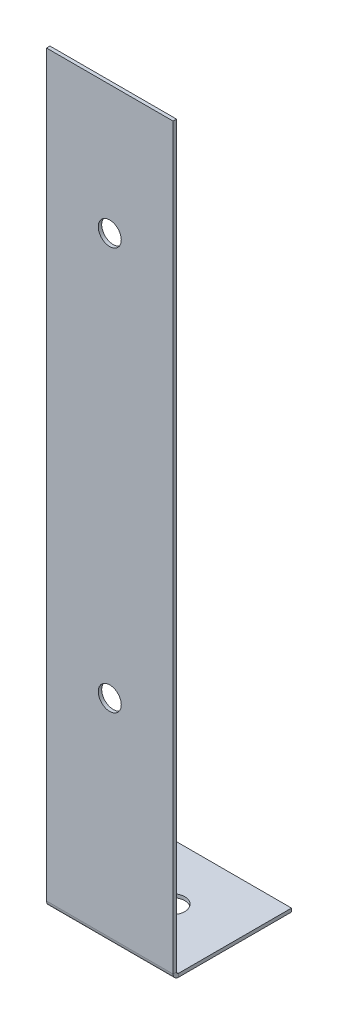
ISO-10303-21;
HEADER;
FILE_DESCRIPTION(('STEP AP214'),'2;1');
FILE_NAME('part.step','',(''),(''),'','','');
FILE_SCHEMA(('AUTOMOTIVE_DESIGN { 1 0 10303 214 1 1 1 1 }'));
ENDSEC;
DATA;
#1=APPLICATION_CONTEXT('core data for automotive mechanical design processes');
#2=APPLICATION_PROTOCOL_DEFINITION('international standard','automotive_design',2000,#1);
#3=PRODUCT_CONTEXT('',#1,'mechanical');
#4=PRODUCT('Part','Part','',(#3));
#5=PRODUCT_RELATED_PRODUCT_CATEGORY('part','',(#4));
#6=PRODUCT_DEFINITION_FORMATION('','',#4);
#7=PRODUCT_DEFINITION_CONTEXT('part definition',#1,'design');
#8=PRODUCT_DEFINITION('design','',#6,#7);
#9=PRODUCT_DEFINITION_SHAPE('','',#8);
#10=(LENGTH_UNIT() NAMED_UNIT(*) SI_UNIT(.MILLI.,.METRE.));
#11=(NAMED_UNIT(*) PLANE_ANGLE_UNIT() SI_UNIT($,.RADIAN.));
#12=(NAMED_UNIT(*) SI_UNIT($,.STERADIAN.) SOLID_ANGLE_UNIT());
#13=UNCERTAINTY_MEASURE_WITH_UNIT(LENGTH_MEASURE(1.E-05),#10,'distance_accuracy_value','');
#14=(GEOMETRIC_REPRESENTATION_CONTEXT(3) GLOBAL_UNCERTAINTY_ASSIGNED_CONTEXT((#13)) GLOBAL_UNIT_ASSIGNED_CONTEXT((#10,
#11,#12)) REPRESENTATION_CONTEXT('',''));
#15=CARTESIAN_POINT('',(0.,0.,0.));
#16=DIRECTION('',(0.,0.,1.));
#17=DIRECTION('',(1.,0.,0.));
#18=AXIS2_PLACEMENT_3D('',#15,#16,#17);
#19=CARTESIAN_POINT('',(-22.,-42.4,-108.8));
#20=DIRECTION('',(-1.,0.,0.));
#21=DIRECTION('',(0.,1.,0.));
#22=AXIS2_PLACEMENT_3D('',#19,#20,#21);
#23=PLANE('',#22);
#24=DIRECTION('',(0.,1.,0.));
#25=VECTOR('',#24,1.);
#26=CARTESIAN_POINT('',(-22.,-42.4,-110.));
#27=LINE('',#26,#25);
#28=CARTESIAN_POINT('',(-22.,0.736600000000001,-110.));
#29=VERTEX_POINT('',#28);
#30=CARTESIAN_POINT('',(-22.,257.6,-110.000000000001));
#31=VERTEX_POINT('',#30);
#32=EDGE_CURVE('E106',#29,#31,#27,.T.);
#33=ORIENTED_EDGE('',*,*,#32,.F.);
#34=DIRECTION('',(0.,0.,1.));
#35=VECTOR('',#34,1.);
#36=CARTESIAN_POINT('',(-22.,0.736600000000004,-108.8));
#37=LINE('',#36,#35);
#38=CARTESIAN_POINT('',(-22.,0.736600000000002,-108.8));
#39=VERTEX_POINT('',#38);
#40=EDGE_CURVE('E118',#29,#39,#37,.T.);
#41=ORIENTED_EDGE('',*,*,#40,.T.);
#42=DIRECTION('',(0.,1.,0.));
#43=VECTOR('',#42,1.);
#44=CARTESIAN_POINT('',(-22.,-42.4,-108.8));
#45=LINE('',#44,#43);
#46=CARTESIAN_POINT('',(-22.,257.6,-108.800000000001));
#47=VERTEX_POINT('',#46);
#48=EDGE_CURVE('E102',#39,#47,#45,.T.);
#49=ORIENTED_EDGE('',*,*,#48,.T.);
#50=DIRECTION('',(0.,0.,-1.));
#51=VECTOR('',#50,1.);
#52=CARTESIAN_POINT('',(-22.,257.6,-108.800000000001));
#53=LINE('',#52,#51);
#54=EDGE_CURVE('E95',#47,#31,#53,.T.);
#55=ORIENTED_EDGE('',*,*,#54,.T.);
#56=EDGE_LOOP('',(#33,#41,#49,#55));
#57=FACE_BOUND('',#56,.T.);
#58=ADVANCED_FACE('F49',(#57),#23,.T.);
#59=CARTESIAN_POINT('',(22.,-42.4,-108.8));
#60=DIRECTION('',(1.,0.,0.));
#61=DIRECTION('',(0.,-1.,0.));
#62=AXIS2_PLACEMENT_3D('',#59,#60,#61);
#63=PLANE('',#62);
#64=DIRECTION('',(0.,-1.,0.));
#65=VECTOR('',#64,1.);
#66=CARTESIAN_POINT('',(22.,-42.4,-108.8));
#67=LINE('',#66,#65);
#68=CARTESIAN_POINT('',(22.,257.6,-108.800000000001));
#69=VERTEX_POINT('',#68);
#70=CARTESIAN_POINT('',(22.,0.736600000000004,-108.8));
#71=VERTEX_POINT('',#70);
#72=EDGE_CURVE('E115',#69,#71,#67,.T.);
#73=ORIENTED_EDGE('',*,*,#72,.T.);
#74=DIRECTION('',(0.,0.,-1.));
#75=VECTOR('',#74,1.);
#76=CARTESIAN_POINT('',(22.,0.736600000000004,-108.8));
#77=LINE('',#76,#75);
#78=CARTESIAN_POINT('',(22.,0.736600000000001,-110.));
#79=VERTEX_POINT('',#78);
#80=EDGE_CURVE('E12',#71,#79,#77,.T.);
#81=ORIENTED_EDGE('',*,*,#80,.T.);
#82=DIRECTION('',(0.,-1.,0.));
#83=VECTOR('',#82,1.);
#84=CARTESIAN_POINT('',(22.,-42.4,-110.));
#85=LINE('',#84,#83);
#86=CARTESIAN_POINT('',(22.,257.6,-110.000000000001));
#87=VERTEX_POINT('',#86);
#88=EDGE_CURVE('E98',#87,#79,#85,.T.);
#89=ORIENTED_EDGE('',*,*,#88,.F.);
#90=DIRECTION('',(0.,0.,-1.));
#91=VECTOR('',#90,1.);
#92=CARTESIAN_POINT('',(22.,257.6,-108.800000000001));
#93=LINE('',#92,#91);
#94=EDGE_CURVE('E75',#69,#87,#93,.T.);
#95=ORIENTED_EDGE('',*,*,#94,.F.);
#96=EDGE_LOOP('',(#73,#81,#89,#95));
#97=FACE_BOUND('',#96,.T.);
#98=ADVANCED_FACE('F51',(#97),#63,.T.);
#99=CARTESIAN_POINT('',(0.,107.6,-108.8));
#100=DIRECTION('',(0.,0.,1.));
#101=DIRECTION('',(0.,-1.,0.));
#102=AXIS2_PLACEMENT_3D('',#99,#100,#101);
#103=PLANE('',#102);
#104=CARTESIAN_POINT('',(0.,72.7999999999999,-108.8));
#105=DIRECTION('',(0.,0.,1.));
#106=DIRECTION('',(1.,0.,0.));
#107=AXIS2_PLACEMENT_3D('',#104,#105,#106);
#108=CIRCLE('',#107,4.);
#109=CARTESIAN_POINT('',(4.,72.7999999999999,-108.8));
#110=VERTEX_POINT('',#109);
#111=EDGE_CURVE('E128',#110,#110,#108,.T.);
#112=ORIENTED_EDGE('',*,*,#111,.F.);
#113=EDGE_LOOP('',(#112));
#114=FACE_BOUND('',#113,.T.);
#115=CARTESIAN_POINT('',(0.,212.8,-108.8));
#116=DIRECTION('',(0.,0.,1.));
#117=DIRECTION('',(1.,0.,0.));
#118=AXIS2_PLACEMENT_3D('',#115,#116,#117);
#119=CIRCLE('',#118,4.);
#120=CARTESIAN_POINT('',(4.,212.8,-108.8));
#121=VERTEX_POINT('',#120);
#122=EDGE_CURVE('E184',#121,#121,#119,.T.);
#123=ORIENTED_EDGE('',*,*,#122,.F.);
#124=EDGE_LOOP('',(#123));
#125=FACE_BOUND('',#124,.T.);
#126=ORIENTED_EDGE('',*,*,#48,.F.);
#127=DIRECTION('',(1.,0.,0.));
#128=VECTOR('',#127,1.);
#129=CARTESIAN_POINT('',(0.,0.736600000000004,-108.8));
#130=LINE('',#129,#128);
#131=EDGE_CURVE('E94',#39,#71,#130,.T.);
#132=ORIENTED_EDGE('',*,*,#131,.T.);
#133=ORIENTED_EDGE('',*,*,#72,.F.);
#134=DIRECTION('',(1.,0.,0.));
#135=VECTOR('',#134,1.);
#136=CARTESIAN_POINT('',(22.,257.6,-108.800000000001));
#137=LINE('',#136,#135);
#138=EDGE_CURVE('E93',#47,#69,#137,.T.);
#139=ORIENTED_EDGE('',*,*,#138,.F.);
#140=EDGE_LOOP('',(#126,#132,#133,#139));
#141=FACE_BOUND('',#140,.T.);
#142=ADVANCED_FACE('F216',(#114,#125,#141),#103,.T.);
#143=CARTESIAN_POINT('',(22.,257.6,-108.800000000001));
#144=DIRECTION('',(0.,1.,0.));
#145=DIRECTION('',(1.,0.,0.));
#146=AXIS2_PLACEMENT_3D('',#143,#144,#145);
#147=PLANE('',#146);
#148=DIRECTION('',(1.,0.,0.));
#149=VECTOR('',#148,1.);
#150=CARTESIAN_POINT('',(22.,257.6,-110.000000000001));
#151=LINE('',#150,#149);
#152=EDGE_CURVE('E91',#31,#87,#151,.T.);
#153=ORIENTED_EDGE('',*,*,#152,.F.);
#154=ORIENTED_EDGE('',*,*,#54,.F.);
#155=ORIENTED_EDGE('',*,*,#138,.T.);
#156=ORIENTED_EDGE('',*,*,#94,.T.);
#157=EDGE_LOOP('',(#153,#154,#155,#156));
#158=FACE_BOUND('',#157,.T.);
#159=ADVANCED_FACE('F88',(#158),#147,.T.);
#160=CARTESIAN_POINT('',(0.,107.6,-110.));
#161=DIRECTION('',(0.,0.,1.));
#162=DIRECTION('',(0.,-1.,0.));
#163=AXIS2_PLACEMENT_3D('',#160,#161,#162);
#164=PLANE('',#163);
#165=CARTESIAN_POINT('',(0.,72.7999999999999,-110.));
#166=DIRECTION('',(0.,0.,1.));
#167=DIRECTION('',(0.,-1.,0.));
#168=AXIS2_PLACEMENT_3D('',#165,#166,#167);
#169=CIRCLE('',#168,4.);
#170=CARTESIAN_POINT('',(0.,68.7999999999999,-110.));
#171=VERTEX_POINT('',#170);
#172=EDGE_CURVE('E127',#171,#171,#169,.T.);
#173=ORIENTED_EDGE('',*,*,#172,.T.);
#174=EDGE_LOOP('',(#173));
#175=FACE_BOUND('',#174,.T.);
#176=CARTESIAN_POINT('',(0.,212.8,-110.000000000001));
#177=DIRECTION('',(0.,0.,1.));
#178=DIRECTION('',(0.,-1.,0.));
#179=AXIS2_PLACEMENT_3D('',#176,#177,#178);
#180=CIRCLE('',#179,4.);
#181=CARTESIAN_POINT('',(0.,208.8,-110.000000000001));
#182=VERTEX_POINT('',#181);
#183=EDGE_CURVE('E125',#182,#182,#180,.T.);
#184=ORIENTED_EDGE('',*,*,#183,.T.);
#185=EDGE_LOOP('',(#184));
#186=FACE_BOUND('',#185,.T.);
#187=DIRECTION('',(1.,0.,0.));
#188=VECTOR('',#187,1.);
#189=CARTESIAN_POINT('',(0.,0.736600000000004,-110.));
#190=LINE('',#189,#188);
#191=EDGE_CURVE('E58',#29,#79,#190,.T.);
#192=ORIENTED_EDGE('',*,*,#191,.F.);
#193=ORIENTED_EDGE('',*,*,#32,.T.);
#194=ORIENTED_EDGE('',*,*,#152,.T.);
#195=ORIENTED_EDGE('',*,*,#88,.T.);
#196=EDGE_LOOP('',(#192,#193,#194,#195));
#197=FACE_BOUND('',#196,.T.);
#198=ADVANCED_FACE('F104',(#175,#186,#197),#164,.F.);
#199=CARTESIAN_POINT('',(22.,-1.2,-150.));
#200=DIRECTION('',(0.,0.,-1.));
#201=DIRECTION('',(-1.,0.,0.));
#202=AXIS2_PLACEMENT_3D('',#199,#200,#201);
#203=PLANE('',#202);
#204=DIRECTION('',(-1.,0.,0.));
#205=VECTOR('',#204,1.);
#206=CARTESIAN_POINT('',(22.,0.,-150.));
#207=LINE('',#206,#205);
#208=CARTESIAN_POINT('',(22.,0.,-150.));
#209=VERTEX_POINT('',#208);
#210=CARTESIAN_POINT('',(-22.,0.,-150.));
#211=VERTEX_POINT('',#210);
#212=EDGE_CURVE('E152',#209,#211,#207,.T.);
#213=ORIENTED_EDGE('',*,*,#212,.F.);
#214=DIRECTION('',(0.,1.,0.));
#215=VECTOR('',#214,1.);
#216=CARTESIAN_POINT('',(22.,-1.2,-150.));
#217=LINE('',#216,#215);
#218=CARTESIAN_POINT('',(22.,-1.2,-150.));
#219=VERTEX_POINT('',#218);
#220=EDGE_CURVE('E109',#219,#209,#217,.T.);
#221=ORIENTED_EDGE('',*,*,#220,.F.);
#222=DIRECTION('',(-1.,0.,0.));
#223=VECTOR('',#222,1.);
#224=CARTESIAN_POINT('',(22.,-1.2,-150.));
#225=LINE('',#224,#223);
#226=CARTESIAN_POINT('',(-22.,-1.2,-150.));
#227=VERTEX_POINT('',#226);
#228=EDGE_CURVE('E170',#219,#227,#225,.T.);
#229=ORIENTED_EDGE('',*,*,#228,.T.);
#230=DIRECTION('',(0.,1.,0.));
#231=VECTOR('',#230,1.);
#232=CARTESIAN_POINT('',(-22.,-1.2,-150.));
#233=LINE('',#232,#231);
#234=EDGE_CURVE('E167',#227,#211,#233,.T.);
#235=ORIENTED_EDGE('',*,*,#234,.T.);
#236=EDGE_LOOP('',(#213,#221,#229,#235));
#237=FACE_BOUND('',#236,.T.);
#238=ADVANCED_FACE('F220',(#237),#203,.T.);
#239=CARTESIAN_POINT('',(0.,-1.2,0.));
#240=DIRECTION('',(0.,-1.,0.));
#241=DIRECTION('',(0.,0.,-1.));
#242=AXIS2_PLACEMENT_3D('',#239,#240,#241);
#243=PLANE('',#242);
#244=CARTESIAN_POINT('',(0.,-1.2,-130.3683));
#245=DIRECTION('',(0.,-1.,0.));
#246=DIRECTION('',(0.,0.,-1.));
#247=AXIS2_PLACEMENT_3D('',#244,#245,#246);
#248=CIRCLE('',#247,4.5);
#249=CARTESIAN_POINT('',(0.,-1.2,-134.8683));
#250=VERTEX_POINT('',#249);
#251=EDGE_CURVE('E189',#250,#250,#248,.T.);
#252=ORIENTED_EDGE('',*,*,#251,.F.);
#253=EDGE_LOOP('',(#252));
#254=FACE_BOUND('',#253,.T.);
#255=DIRECTION('',(1.,0.,0.));
#256=VECTOR('',#255,1.);
#257=CARTESIAN_POINT('',(0.,-1.2,-110.7366));
#258=LINE('',#257,#256);
#259=CARTESIAN_POINT('',(-22.,-1.2,-110.7366));
#260=VERTEX_POINT('',#259);
#261=CARTESIAN_POINT('',(22.,-1.2,-110.7366));
#262=VERTEX_POINT('',#261);
#263=EDGE_CURVE('E177',#260,#262,#258,.T.);
#264=ORIENTED_EDGE('',*,*,#263,.F.);
#265=DIRECTION('',(0.,0.,1.));
#266=VECTOR('',#265,1.);
#267=CARTESIAN_POINT('',(-22.,-1.2,-150.));
#268=LINE('',#267,#266);
#269=EDGE_CURVE('E164',#227,#260,#268,.T.);
#270=ORIENTED_EDGE('',*,*,#269,.F.);
#271=ORIENTED_EDGE('',*,*,#228,.F.);
#272=DIRECTION('',(0.,0.,-1.));
#273=VECTOR('',#272,1.);
#274=CARTESIAN_POINT('',(22.,-1.2,-150.));
#275=LINE('',#274,#273);
#276=EDGE_CURVE('E149',#262,#219,#275,.T.);
#277=ORIENTED_EDGE('',*,*,#276,.F.);
#278=EDGE_LOOP('',(#264,#270,#271,#277));
#279=FACE_BOUND('',#278,.T.);
#280=ADVANCED_FACE('F226',(#254,#279),#243,.T.);
#281=CARTESIAN_POINT('',(-22.,-1.2,-150.));
#282=DIRECTION('',(-1.,0.,0.));
#283=DIRECTION('',(0.,0.,1.));
#284=AXIS2_PLACEMENT_3D('',#281,#282,#283);
#285=PLANE('',#284);
#286=DIRECTION('',(0.,-1.,0.));
#287=VECTOR('',#286,1.);
#288=CARTESIAN_POINT('',(-22.,-1.2,-110.7366));
#289=LINE('',#288,#287);
#290=CARTESIAN_POINT('',(-22.,0.,-110.7366));
#291=VERTEX_POINT('',#290);
#292=EDGE_CURVE('E173',#291,#260,#289,.T.);
#293=ORIENTED_EDGE('',*,*,#292,.F.);
#294=DIRECTION('',(0.,0.,1.));
#295=VECTOR('',#294,1.);
#296=CARTESIAN_POINT('',(-22.,0.,-150.));
#297=LINE('',#296,#295);
#298=EDGE_CURVE('E161',#211,#291,#297,.T.);
#299=ORIENTED_EDGE('',*,*,#298,.F.);
#300=ORIENTED_EDGE('',*,*,#234,.F.);
#301=ORIENTED_EDGE('',*,*,#269,.T.);
#302=EDGE_LOOP('',(#293,#299,#300,#301));
#303=FACE_BOUND('',#302,.T.);
#304=ADVANCED_FACE('F255',(#303),#285,.T.);
#305=CARTESIAN_POINT('',(0.,0.,0.));
#306=DIRECTION('',(0.,-1.,0.));
#307=DIRECTION('',(0.,0.,-1.));
#308=AXIS2_PLACEMENT_3D('',#305,#306,#307);
#309=PLANE('',#308);
#310=CARTESIAN_POINT('',(0.,0.,-130.3683));
#311=DIRECTION('',(0.,-1.,0.));
#312=DIRECTION('',(0.,0.,-1.));
#313=AXIS2_PLACEMENT_3D('',#310,#311,#312);
#314=CIRCLE('',#313,4.5);
#315=CARTESIAN_POINT('',(0.,0.,-134.8683));
#316=VERTEX_POINT('',#315);
#317=EDGE_CURVE('E53',#316,#316,#314,.T.);
#318=ORIENTED_EDGE('',*,*,#317,.T.);
#319=EDGE_LOOP('',(#318));
#320=FACE_BOUND('',#319,.T.);
#321=ORIENTED_EDGE('',*,*,#298,.T.);
#322=DIRECTION('',(1.,0.,0.));
#323=VECTOR('',#322,1.);
#324=CARTESIAN_POINT('',(0.,0.,-110.7366));
#325=LINE('',#324,#323);
#326=CARTESIAN_POINT('',(22.,0.,-110.7366));
#327=VERTEX_POINT('',#326);
#328=EDGE_CURVE('E158',#291,#327,#325,.T.);
#329=ORIENTED_EDGE('',*,*,#328,.T.);
#330=DIRECTION('',(0.,0.,-1.));
#331=VECTOR('',#330,1.);
#332=CARTESIAN_POINT('',(22.,0.,-150.));
#333=LINE('',#332,#331);
#334=EDGE_CURVE('E155',#327,#209,#333,.T.);
#335=ORIENTED_EDGE('',*,*,#334,.T.);
#336=ORIENTED_EDGE('',*,*,#212,.T.);
#337=EDGE_LOOP('',(#321,#329,#335,#336));
#338=FACE_BOUND('',#337,.T.);
#339=ADVANCED_FACE('F196',(#320,#338),#309,.F.);
#340=CARTESIAN_POINT('',(22.,-1.2,-150.));
#341=DIRECTION('',(1.,0.,0.));
#342=DIRECTION('',(0.,0.,-1.));
#343=AXIS2_PLACEMENT_3D('',#340,#341,#342);
#344=PLANE('',#343);
#345=DIRECTION('',(0.,1.,0.));
#346=VECTOR('',#345,1.);
#347=CARTESIAN_POINT('',(22.,-1.2,-110.7366));
#348=LINE('',#347,#346);
#349=EDGE_CURVE('E175',#262,#327,#348,.T.);
#350=ORIENTED_EDGE('',*,*,#349,.F.);
#351=ORIENTED_EDGE('',*,*,#276,.T.);
#352=ORIENTED_EDGE('',*,*,#220,.T.);
#353=ORIENTED_EDGE('',*,*,#334,.F.);
#354=EDGE_LOOP('',(#350,#351,#352,#353));
#355=FACE_BOUND('',#354,.T.);
#356=ADVANCED_FACE('F249',(#355),#344,.T.);
#357=CARTESIAN_POINT('',(-22.,0.7366,-110.7366));
#358=DIRECTION('',(-1.,0.,0.));
#359=DIRECTION('',(0.,0.,1.));
#360=AXIS2_PLACEMENT_3D('',#357,#358,#359);
#361=PLANE('',#360);
#362=ORIENTED_EDGE('',*,*,#40,.F.);
#363=CARTESIAN_POINT('',(-22.,0.7366,-110.7366));
#364=DIRECTION('',(-1.,0.,0.));
#365=DIRECTION('',(0.,0.,1.));
#366=AXIS2_PLACEMENT_3D('',#363,#364,#365);
#367=CIRCLE('',#366,0.7366);
#368=EDGE_CURVE('E130',#29,#291,#367,.F.);
#369=ORIENTED_EDGE('',*,*,#368,.T.);
#370=ORIENTED_EDGE('',*,*,#292,.T.);
#371=CARTESIAN_POINT('',(-22.,0.7366,-110.7366));
#372=DIRECTION('',(1.,0.,0.));
#373=DIRECTION('',(0.,0.,1.));
#374=AXIS2_PLACEMENT_3D('',#371,#372,#373);
#375=CIRCLE('',#374,1.9366);
#376=EDGE_CURVE('E142',#39,#260,#375,.T.);
#377=ORIENTED_EDGE('',*,*,#376,.F.);
#378=EDGE_LOOP('',(#362,#369,#370,#377));
#379=FACE_BOUND('',#378,.T.);
#380=ADVANCED_FACE('F246',(#379),#361,.T.);
#381=CARTESIAN_POINT('',(22.,0.7366,-110.7366));
#382=DIRECTION('',(1.,0.,0.));
#383=DIRECTION('',(0.,0.,-1.));
#384=AXIS2_PLACEMENT_3D('',#381,#382,#383);
#385=PLANE('',#384);
#386=CARTESIAN_POINT('',(22.,0.7366,-110.7366));
#387=DIRECTION('',(-1.,0.,0.));
#388=DIRECTION('',(0.,0.,1.));
#389=AXIS2_PLACEMENT_3D('',#386,#387,#388);
#390=CIRCLE('',#389,0.7366);
#391=EDGE_CURVE('E134',#327,#79,#390,.T.);
#392=ORIENTED_EDGE('',*,*,#391,.T.);
#393=ORIENTED_EDGE('',*,*,#80,.F.);
#394=CARTESIAN_POINT('',(22.,0.7366,-110.7366));
#395=DIRECTION('',(-1.,0.,0.));
#396=DIRECTION('',(0.,0.,-1.));
#397=AXIS2_PLACEMENT_3D('',#394,#395,#396);
#398=CIRCLE('',#397,1.9366);
#399=EDGE_CURVE('E66',#262,#71,#398,.T.);
#400=ORIENTED_EDGE('',*,*,#399,.F.);
#401=ORIENTED_EDGE('',*,*,#349,.T.);
#402=EDGE_LOOP('',(#392,#393,#400,#401));
#403=FACE_BOUND('',#402,.T.);
#404=ADVANCED_FACE('F244',(#403),#385,.T.);
#405=CARTESIAN_POINT('',(44.1864422446524,0.7366,-110.7366));
#406=DIRECTION('',(-1.,0.,0.));
#407=DIRECTION('',(0.,0.,1.));
#408=AXIS2_PLACEMENT_3D('',#405,#406,#407);
#409=CYLINDRICAL_SURFACE('',#408,1.9366);
#410=ORIENTED_EDGE('',*,*,#263,.T.);
#411=ORIENTED_EDGE('',*,*,#399,.T.);
#412=ORIENTED_EDGE('',*,*,#131,.F.);
#413=ORIENTED_EDGE('',*,*,#376,.T.);
#414=EDGE_LOOP('',(#410,#411,#412,#413));
#415=FACE_BOUND('',#414,.T.);
#416=ADVANCED_FACE('F239',(#415),#409,.T.);
#417=CARTESIAN_POINT('',(44.1864422446524,0.7366,-110.7366));
#418=DIRECTION('',(-1.,0.,0.));
#419=DIRECTION('',(0.,0.,1.));
#420=AXIS2_PLACEMENT_3D('',#417,#418,#419);
#421=CYLINDRICAL_SURFACE('',#420,0.7366);
#422=ORIENTED_EDGE('',*,*,#328,.F.);
#423=ORIENTED_EDGE('',*,*,#368,.F.);
#424=ORIENTED_EDGE('',*,*,#191,.T.);
#425=ORIENTED_EDGE('',*,*,#391,.F.);
#426=EDGE_LOOP('',(#422,#423,#424,#425));
#427=FACE_BOUND('',#426,.T.);
#428=ADVANCED_FACE('F233',(#427),#421,.F.);
#429=CARTESIAN_POINT('',(0.,212.8,-118.8));
#430=DIRECTION('',(0.,0.,1.));
#431=DIRECTION('',(1.,0.,0.));
#432=AXIS2_PLACEMENT_3D('',#429,#430,#431);
#433=CYLINDRICAL_SURFACE('',#432,4.);
#434=ORIENTED_EDGE('',*,*,#122,.T.);
#435=EDGE_LOOP('',(#434));
#436=FACE_BOUND('',#435,.T.);
#437=ORIENTED_EDGE('',*,*,#183,.F.);
#438=EDGE_LOOP('',(#437));
#439=FACE_BOUND('',#438,.T.);
#440=ADVANCED_FACE('F207',(#436,#439),#433,.F.);
#441=CARTESIAN_POINT('',(0.,72.7999999999999,-118.8));
#442=DIRECTION('',(0.,0.,1.));
#443=DIRECTION('',(1.,0.,0.));
#444=AXIS2_PLACEMENT_3D('',#441,#442,#443);
#445=CYLINDRICAL_SURFACE('',#444,4.);
#446=ORIENTED_EDGE('',*,*,#111,.T.);
#447=EDGE_LOOP('',(#446));
#448=FACE_BOUND('',#447,.T.);
#449=ORIENTED_EDGE('',*,*,#172,.F.);
#450=EDGE_LOOP('',(#449));
#451=FACE_BOUND('',#450,.T.);
#452=ADVANCED_FACE('F201',(#448,#451),#445,.F.);
#453=CARTESIAN_POINT('',(0.,8.8,-130.3683));
#454=DIRECTION('',(0.,-1.,0.));
#455=DIRECTION('',(0.,0.,-1.));
#456=AXIS2_PLACEMENT_3D('',#453,#454,#455);
#457=CYLINDRICAL_SURFACE('',#456,4.5);
#458=ORIENTED_EDGE('',*,*,#251,.T.);
#459=EDGE_LOOP('',(#458));
#460=FACE_BOUND('',#459,.T.);
#461=ORIENTED_EDGE('',*,*,#317,.F.);
#462=EDGE_LOOP('',(#461));
#463=FACE_BOUND('',#462,.T.);
#464=ADVANCED_FACE('F199',(#460,#463),#457,.F.);
#465=CLOSED_SHELL('',(#58,#98,#142,#159,#198,#238,#280,#304,#339,#356,#380,#404,#416,#428,#440,
#452,#464));
#466=MANIFOLD_SOLID_BREP('B2',#465);
#467=ADVANCED_BREP_SHAPE_REPRESENTATION('',(#18,#466),#14);
#468=SHAPE_DEFINITION_REPRESENTATION(#9,#467);
ENDSEC;
END-ISO-10303-21;
